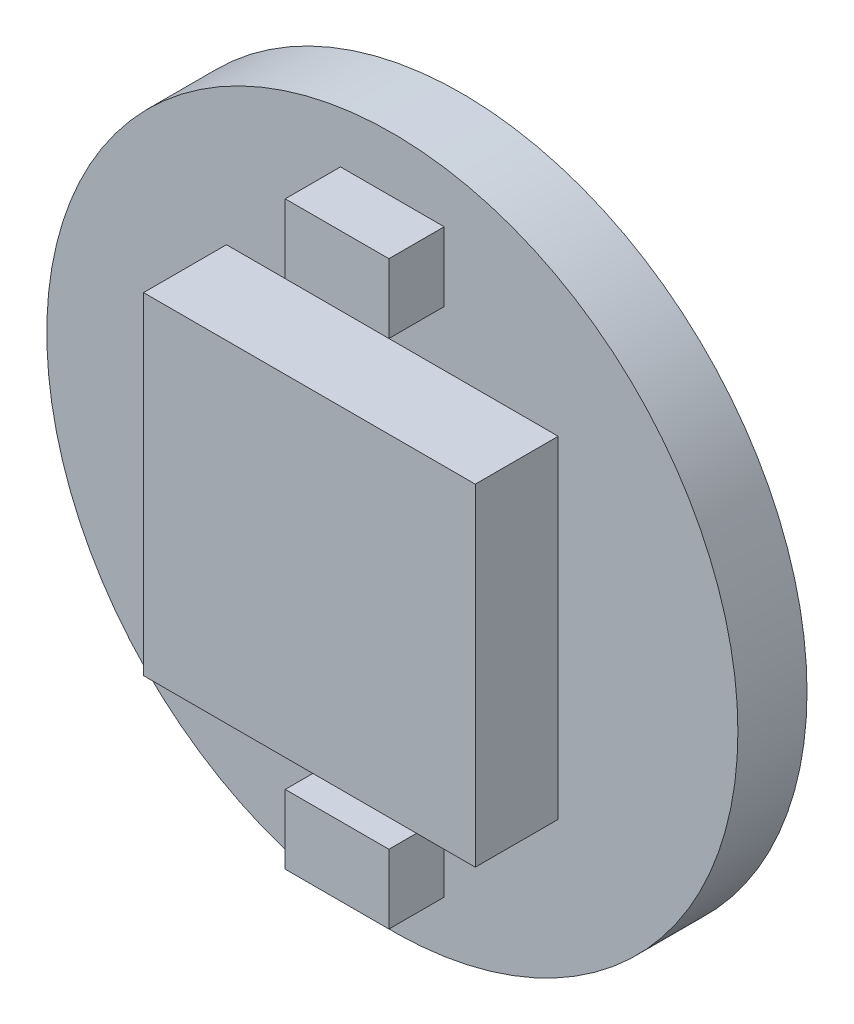
ISO-10303-21;
HEADER;
FILE_DESCRIPTION(('STEP AP214'),'2;1');
FILE_NAME('part.step','',(''),(''),'','','');
FILE_SCHEMA(('AUTOMOTIVE_DESIGN { 1 0 10303 214 1 1 1 1 }'));
ENDSEC;
DATA;
#1=APPLICATION_CONTEXT('core data for automotive mechanical design processes');
#2=APPLICATION_PROTOCOL_DEFINITION('international standard','automotive_design',2000,#1);
#3=PRODUCT_CONTEXT('',#1,'mechanical');
#4=PRODUCT('Part','Part','',(#3));
#5=PRODUCT_RELATED_PRODUCT_CATEGORY('part','',(#4));
#6=PRODUCT_DEFINITION_FORMATION('','',#4);
#7=PRODUCT_DEFINITION_CONTEXT('part definition',#1,'design');
#8=PRODUCT_DEFINITION('design','',#6,#7);
#9=PRODUCT_DEFINITION_SHAPE('','',#8);
#10=(LENGTH_UNIT() NAMED_UNIT(*) SI_UNIT(.MILLI.,.METRE.));
#11=(NAMED_UNIT(*) PLANE_ANGLE_UNIT() SI_UNIT($,.RADIAN.));
#12=(NAMED_UNIT(*) SI_UNIT($,.STERADIAN.) SOLID_ANGLE_UNIT());
#13=UNCERTAINTY_MEASURE_WITH_UNIT(LENGTH_MEASURE(1.E-05),#10,'distance_accuracy_value','');
#14=(GEOMETRIC_REPRESENTATION_CONTEXT(3) GLOBAL_UNCERTAINTY_ASSIGNED_CONTEXT((#13)) GLOBAL_UNIT_ASSIGNED_CONTEXT((#10,
#11,#12)) REPRESENTATION_CONTEXT('',''));
#15=CARTESIAN_POINT('',(0.,0.,0.));
#16=DIRECTION('',(0.,0.,1.));
#17=DIRECTION('',(1.,0.,0.));
#18=AXIS2_PLACEMENT_3D('',#15,#16,#17);
#19=CARTESIAN_POINT('',(0.,0.,1.));
#20=DIRECTION('',(0.,0.,-1.));
#21=DIRECTION('',(-1.,0.,0.));
#22=AXIS2_PLACEMENT_3D('',#19,#20,#21);
#23=CYLINDRICAL_SURFACE('',#22,5.);
#24=CARTESIAN_POINT('',(0.,0.,1.));
#25=DIRECTION('',(0.,0.,1.));
#26=DIRECTION('',(1.,0.,0.));
#27=AXIS2_PLACEMENT_3D('',#24,#25,#26);
#28=CIRCLE('',#27,5.);
#29=CARTESIAN_POINT('',(5.,0.,1.));
#30=VERTEX_POINT('',#29);
#31=EDGE_CURVE('E11',#30,#30,#28,.T.);
#32=ORIENTED_EDGE('',*,*,#31,.F.);
#33=EDGE_LOOP('',(#32));
#34=FACE_BOUND('',#33,.T.);
#35=CARTESIAN_POINT('',(0.,0.,0.));
#36=DIRECTION('',(0.,0.,1.));
#37=DIRECTION('',(1.,0.,0.));
#38=AXIS2_PLACEMENT_3D('',#35,#36,#37);
#39=CIRCLE('',#38,5.);
#40=CARTESIAN_POINT('',(5.,0.,0.));
#41=VERTEX_POINT('',#40);
#42=EDGE_CURVE('E54',#41,#41,#39,.T.);
#43=ORIENTED_EDGE('',*,*,#42,.T.);
#44=EDGE_LOOP('',(#43));
#45=FACE_BOUND('',#44,.T.);
#46=ADVANCED_FACE('F51',(#34,#45),#23,.T.);
#47=CARTESIAN_POINT('',(0.,0.,1.));
#48=DIRECTION('',(0.,0.,1.));
#49=DIRECTION('',(1.,0.,0.));
#50=AXIS2_PLACEMENT_3D('',#47,#48,#49);
#51=PLANE('',#50);
#52=DIRECTION('',(0.,-1.,0.));
#53=VECTOR('',#52,1.);
#54=CARTESIAN_POINT('',(0.75,0.,1.));
#55=LINE('',#54,#53);
#56=CARTESIAN_POINT('',(0.75,4.2,1.));
#57=VERTEX_POINT('',#56);
#58=CARTESIAN_POINT('',(0.75,3.2,1.));
#59=VERTEX_POINT('',#58);
#60=EDGE_CURVE('E147',#57,#59,#55,.T.);
#61=ORIENTED_EDGE('',*,*,#60,.T.);
#62=DIRECTION('',(1.,0.,0.));
#63=VECTOR('',#62,1.);
#64=CARTESIAN_POINT('',(0.,3.2,1.));
#65=LINE('',#64,#63);
#66=CARTESIAN_POINT('',(-0.75,3.2,1.));
#67=VERTEX_POINT('',#66);
#68=EDGE_CURVE('E163',#67,#59,#65,.T.);
#69=ORIENTED_EDGE('',*,*,#68,.F.);
#70=DIRECTION('',(0.,-1.,0.));
#71=VECTOR('',#70,1.);
#72=CARTESIAN_POINT('',(-0.749999999999999,0.,1.));
#73=LINE('',#72,#71);
#74=CARTESIAN_POINT('',(-0.75,4.2,1.));
#75=VERTEX_POINT('',#74);
#76=EDGE_CURVE('E181',#75,#67,#73,.T.);
#77=ORIENTED_EDGE('',*,*,#76,.F.);
#78=DIRECTION('',(1.,0.,0.));
#79=VECTOR('',#78,1.);
#80=CARTESIAN_POINT('',(0.,4.2,1.));
#81=LINE('',#80,#79);
#82=EDGE_CURVE('E178',#75,#57,#81,.T.);
#83=ORIENTED_EDGE('',*,*,#82,.T.);
#84=EDGE_LOOP('',(#61,#69,#77,#83));
#85=FACE_BOUND('',#84,.T.);
#86=DIRECTION('',(0.,1.,0.));
#87=VECTOR('',#86,1.);
#88=CARTESIAN_POINT('',(-0.749999999999999,0.,1.));
#89=LINE('',#88,#87);
#90=CARTESIAN_POINT('',(-0.75,-4.2,1.));
#91=VERTEX_POINT('',#90);
#92=CARTESIAN_POINT('',(-0.75,-3.2,1.));
#93=VERTEX_POINT('',#92);
#94=EDGE_CURVE('E153',#91,#93,#89,.T.);
#95=ORIENTED_EDGE('',*,*,#94,.T.);
#96=DIRECTION('',(1.,0.,0.));
#97=VECTOR('',#96,1.);
#98=CARTESIAN_POINT('',(0.,-3.2,1.));
#99=LINE('',#98,#97);
#100=CARTESIAN_POINT('',(0.75,-3.2,1.));
#101=VERTEX_POINT('',#100);
#102=EDGE_CURVE('E197',#93,#101,#99,.T.);
#103=ORIENTED_EDGE('',*,*,#102,.T.);
#104=DIRECTION('',(0.,1.,0.));
#105=VECTOR('',#104,1.);
#106=CARTESIAN_POINT('',(0.75,0.,1.));
#107=LINE('',#106,#105);
#108=CARTESIAN_POINT('',(0.75,-4.2,1.));
#109=VERTEX_POINT('',#108);
#110=EDGE_CURVE('E212',#109,#101,#107,.T.);
#111=ORIENTED_EDGE('',*,*,#110,.F.);
#112=DIRECTION('',(1.,0.,0.));
#113=VECTOR('',#112,1.);
#114=CARTESIAN_POINT('',(0.,-4.2,1.));
#115=LINE('',#114,#113);
#116=EDGE_CURVE('E74',#91,#109,#115,.T.);
#117=ORIENTED_EDGE('',*,*,#116,.F.);
#118=EDGE_LOOP('',(#95,#103,#111,#117));
#119=FACE_BOUND('',#118,.T.);
#120=DIRECTION('',(0.,1.,0.));
#121=VECTOR('',#120,1.);
#122=CARTESIAN_POINT('',(2.4,2.4,1.));
#123=LINE('',#122,#121);
#124=CARTESIAN_POINT('',(2.4,-2.4,1.));
#125=VERTEX_POINT('',#124);
#126=CARTESIAN_POINT('',(2.4,2.4,1.));
#127=VERTEX_POINT('',#126);
#128=EDGE_CURVE('E232',#125,#127,#123,.T.);
#129=ORIENTED_EDGE('',*,*,#128,.F.);
#130=DIRECTION('',(1.,0.,0.));
#131=VECTOR('',#130,1.);
#132=CARTESIAN_POINT('',(-2.4,-2.4,1.));
#133=LINE('',#132,#131);
#134=CARTESIAN_POINT('',(-2.4,-2.4,1.));
#135=VERTEX_POINT('',#134);
#136=EDGE_CURVE('E238',#135,#125,#133,.T.);
#137=ORIENTED_EDGE('',*,*,#136,.F.);
#138=DIRECTION('',(0.,-1.,0.));
#139=VECTOR('',#138,1.);
#140=CARTESIAN_POINT('',(-2.4,2.4,1.));
#141=LINE('',#140,#139);
#142=CARTESIAN_POINT('',(-2.4,2.4,1.));
#143=VERTEX_POINT('',#142);
#144=EDGE_CURVE('E255',#143,#135,#141,.T.);
#145=ORIENTED_EDGE('',*,*,#144,.F.);
#146=DIRECTION('',(-1.,0.,0.));
#147=VECTOR('',#146,1.);
#148=CARTESIAN_POINT('',(-2.4,2.4,1.));
#149=LINE('',#148,#147);
#150=EDGE_CURVE('E251',#127,#143,#149,.T.);
#151=ORIENTED_EDGE('',*,*,#150,.F.);
#152=EDGE_LOOP('',(#129,#137,#145,#151));
#153=FACE_BOUND('',#152,.T.);
#154=ORIENTED_EDGE('',*,*,#31,.T.);
#155=EDGE_LOOP('',(#154));
#156=FACE_BOUND('',#155,.T.);
#157=ADVANCED_FACE('F286',(#85,#119,#153,#156),#51,.T.);
#158=CARTESIAN_POINT('',(0.,0.,0.));
#159=DIRECTION('',(0.,0.,1.));
#160=DIRECTION('',(1.,0.,0.));
#161=AXIS2_PLACEMENT_3D('',#158,#159,#160);
#162=PLANE('',#161);
#163=ORIENTED_EDGE('',*,*,#42,.F.);
#164=EDGE_LOOP('',(#163));
#165=FACE_BOUND('',#164,.T.);
#166=ADVANCED_FACE('F283',(#165),#162,.F.);
#167=CARTESIAN_POINT('',(2.4,2.4,2.2));
#168=DIRECTION('',(-1.,0.,0.));
#169=DIRECTION('',(0.,-1.,0.));
#170=AXIS2_PLACEMENT_3D('',#167,#168,#169);
#171=PLANE('',#170);
#172=ORIENTED_EDGE('',*,*,#128,.T.);
#173=DIRECTION('',(0.,0.,-1.));
#174=VECTOR('',#173,1.);
#175=CARTESIAN_POINT('',(2.4,2.4,2.2));
#176=LINE('',#175,#174);
#177=CARTESIAN_POINT('',(2.4,2.4,2.2));
#178=VERTEX_POINT('',#177);
#179=EDGE_CURVE('E273',#178,#127,#176,.T.);
#180=ORIENTED_EDGE('',*,*,#179,.F.);
#181=DIRECTION('',(0.,1.,0.));
#182=VECTOR('',#181,1.);
#183=CARTESIAN_POINT('',(2.4,2.4,2.2));
#184=LINE('',#183,#182);
#185=CARTESIAN_POINT('',(2.4,-2.4,2.2));
#186=VERTEX_POINT('',#185);
#187=EDGE_CURVE('E233',#186,#178,#184,.T.);
#188=ORIENTED_EDGE('',*,*,#187,.F.);
#189=DIRECTION('',(0.,0.,-1.));
#190=VECTOR('',#189,1.);
#191=CARTESIAN_POINT('',(2.4,-2.4,2.2));
#192=LINE('',#191,#190);
#193=EDGE_CURVE('E247',#186,#125,#192,.T.);
#194=ORIENTED_EDGE('',*,*,#193,.T.);
#195=EDGE_LOOP('',(#172,#180,#188,#194));
#196=FACE_BOUND('',#195,.T.);
#197=ADVANCED_FACE('F285',(#196),#171,.F.);
#198=CARTESIAN_POINT('',(-2.4,2.4,2.2));
#199=DIRECTION('',(0.,-1.,0.));
#200=DIRECTION('',(0.,0.,-1.));
#201=AXIS2_PLACEMENT_3D('',#198,#199,#200);
#202=PLANE('',#201);
#203=ORIENTED_EDGE('',*,*,#150,.T.);
#204=DIRECTION('',(0.,0.,-1.));
#205=VECTOR('',#204,1.);
#206=CARTESIAN_POINT('',(-2.4,2.4,2.2));
#207=LINE('',#206,#205);
#208=CARTESIAN_POINT('',(-2.4,2.4,2.2));
#209=VERTEX_POINT('',#208);
#210=EDGE_CURVE('E269',#209,#143,#207,.T.);
#211=ORIENTED_EDGE('',*,*,#210,.F.);
#212=DIRECTION('',(-1.,0.,0.));
#213=VECTOR('',#212,1.);
#214=CARTESIAN_POINT('',(-2.4,2.4,2.2));
#215=LINE('',#214,#213);
#216=EDGE_CURVE('E237',#178,#209,#215,.T.);
#217=ORIENTED_EDGE('',*,*,#216,.F.);
#218=ORIENTED_EDGE('',*,*,#179,.T.);
#219=EDGE_LOOP('',(#203,#211,#217,#218));
#220=FACE_BOUND('',#219,.T.);
#221=ADVANCED_FACE('F291',(#220),#202,.F.);
#222=CARTESIAN_POINT('',(-2.4,2.4,2.2));
#223=DIRECTION('',(1.,0.,0.));
#224=DIRECTION('',(0.,1.,0.));
#225=AXIS2_PLACEMENT_3D('',#222,#223,#224);
#226=PLANE('',#225);
#227=ORIENTED_EDGE('',*,*,#144,.T.);
#228=DIRECTION('',(0.,0.,-1.));
#229=VECTOR('',#228,1.);
#230=CARTESIAN_POINT('',(-2.4,-2.4,2.2));
#231=LINE('',#230,#229);
#232=CARTESIAN_POINT('',(-2.4,-2.4,2.2));
#233=VERTEX_POINT('',#232);
#234=EDGE_CURVE('E265',#233,#135,#231,.T.);
#235=ORIENTED_EDGE('',*,*,#234,.F.);
#236=DIRECTION('',(0.,-1.,0.));
#237=VECTOR('',#236,1.);
#238=CARTESIAN_POINT('',(-2.4,2.4,2.2));
#239=LINE('',#238,#237);
#240=EDGE_CURVE('E241',#209,#233,#239,.T.);
#241=ORIENTED_EDGE('',*,*,#240,.F.);
#242=ORIENTED_EDGE('',*,*,#210,.T.);
#243=EDGE_LOOP('',(#227,#235,#241,#242));
#244=FACE_BOUND('',#243,.T.);
#245=ADVANCED_FACE('F327',(#244),#226,.F.);
#246=CARTESIAN_POINT('',(-2.4,-2.4,2.2));
#247=DIRECTION('',(0.,1.,0.));
#248=DIRECTION('',(0.,0.,1.));
#249=AXIS2_PLACEMENT_3D('',#246,#247,#248);
#250=PLANE('',#249);
#251=ORIENTED_EDGE('',*,*,#136,.T.);
#252=ORIENTED_EDGE('',*,*,#193,.F.);
#253=DIRECTION('',(1.,0.,0.));
#254=VECTOR('',#253,1.);
#255=CARTESIAN_POINT('',(-2.4,-2.4,2.2));
#256=LINE('',#255,#254);
#257=EDGE_CURVE('E244',#233,#186,#256,.T.);
#258=ORIENTED_EDGE('',*,*,#257,.F.);
#259=ORIENTED_EDGE('',*,*,#234,.T.);
#260=EDGE_LOOP('',(#251,#252,#258,#259));
#261=FACE_BOUND('',#260,.T.);
#262=ADVANCED_FACE('F336',(#261),#250,.F.);
#263=CARTESIAN_POINT('',(0.,0.,2.2));
#264=DIRECTION('',(0.,0.,1.));
#265=DIRECTION('',(1.,0.,0.));
#266=AXIS2_PLACEMENT_3D('',#263,#264,#265);
#267=PLANE('',#266);
#268=ORIENTED_EDGE('',*,*,#187,.T.);
#269=ORIENTED_EDGE('',*,*,#216,.T.);
#270=ORIENTED_EDGE('',*,*,#240,.T.);
#271=ORIENTED_EDGE('',*,*,#257,.T.);
#272=EDGE_LOOP('',(#268,#269,#270,#271));
#273=FACE_BOUND('',#272,.T.);
#274=ADVANCED_FACE('F346',(#273),#267,.T.);
#275=CARTESIAN_POINT('',(-0.749999999999999,0.,1.8));
#276=DIRECTION('',(-1.,0.,0.));
#277=DIRECTION('',(0.,-1.,0.));
#278=AXIS2_PLACEMENT_3D('',#275,#276,#277);
#279=PLANE('',#278);
#280=ORIENTED_EDGE('',*,*,#94,.F.);
#281=DIRECTION('',(0.,0.,-1.));
#282=VECTOR('',#281,1.);
#283=CARTESIAN_POINT('',(-0.75,-4.2,1.8));
#284=LINE('',#283,#282);
#285=CARTESIAN_POINT('',(-0.75,-4.2,1.8));
#286=VERTEX_POINT('',#285);
#287=EDGE_CURVE('E229',#286,#91,#284,.T.);
#288=ORIENTED_EDGE('',*,*,#287,.F.);
#289=DIRECTION('',(0.,1.,0.));
#290=VECTOR('',#289,1.);
#291=CARTESIAN_POINT('',(-0.749999999999999,0.,1.8));
#292=LINE('',#291,#290);
#293=CARTESIAN_POINT('',(-0.75,-3.2,1.8));
#294=VERTEX_POINT('',#293);
#295=EDGE_CURVE('E192',#286,#294,#292,.T.);
#296=ORIENTED_EDGE('',*,*,#295,.T.);
#297=DIRECTION('',(0.,0.,-1.));
#298=VECTOR('',#297,1.);
#299=CARTESIAN_POINT('',(-0.75,-3.2,1.8));
#300=LINE('',#299,#298);
#301=EDGE_CURVE('E207',#294,#93,#300,.T.);
#302=ORIENTED_EDGE('',*,*,#301,.T.);
#303=EDGE_LOOP('',(#280,#288,#296,#302));
#304=FACE_BOUND('',#303,.T.);
#305=ADVANCED_FACE('F355',(#304),#279,.T.);
#306=CARTESIAN_POINT('',(0.,-4.2,1.8));
#307=DIRECTION('',(0.,1.,0.));
#308=DIRECTION('',(0.,0.,1.));
#309=AXIS2_PLACEMENT_3D('',#306,#307,#308);
#310=PLANE('',#309);
#311=ORIENTED_EDGE('',*,*,#116,.T.);
#312=DIRECTION('',(0.,0.,-1.));
#313=VECTOR('',#312,1.);
#314=CARTESIAN_POINT('',(0.75,-4.2,1.8));
#315=LINE('',#314,#313);
#316=CARTESIAN_POINT('',(0.75,-4.2,1.8));
#317=VERTEX_POINT('',#316);
#318=EDGE_CURVE('E225',#317,#109,#315,.T.);
#319=ORIENTED_EDGE('',*,*,#318,.F.);
#320=DIRECTION('',(1.,0.,0.));
#321=VECTOR('',#320,1.);
#322=CARTESIAN_POINT('',(0.,-4.2,1.8));
#323=LINE('',#322,#321);
#324=EDGE_CURVE('E196',#286,#317,#323,.T.);
#325=ORIENTED_EDGE('',*,*,#324,.F.);
#326=ORIENTED_EDGE('',*,*,#287,.T.);
#327=EDGE_LOOP('',(#311,#319,#325,#326));
#328=FACE_BOUND('',#327,.T.);
#329=ADVANCED_FACE('F364',(#328),#310,.F.);
#330=CARTESIAN_POINT('',(0.75,0.,1.8));
#331=DIRECTION('',(-1.,0.,0.));
#332=DIRECTION('',(0.,0.,1.));
#333=AXIS2_PLACEMENT_3D('',#330,#331,#332);
#334=PLANE('',#333);
#335=ORIENTED_EDGE('',*,*,#110,.T.);
#336=DIRECTION('',(0.,0.,-1.));
#337=VECTOR('',#336,1.);
#338=CARTESIAN_POINT('',(0.75,-3.2,1.8));
#339=LINE('',#338,#337);
#340=CARTESIAN_POINT('',(0.75,-3.2,1.8));
#341=VERTEX_POINT('',#340);
#342=EDGE_CURVE('E221',#341,#101,#339,.T.);
#343=ORIENTED_EDGE('',*,*,#342,.F.);
#344=DIRECTION('',(0.,1.,0.));
#345=VECTOR('',#344,1.);
#346=CARTESIAN_POINT('',(0.75,0.,1.8));
#347=LINE('',#346,#345);
#348=EDGE_CURVE('E200',#317,#341,#347,.T.);
#349=ORIENTED_EDGE('',*,*,#348,.F.);
#350=ORIENTED_EDGE('',*,*,#318,.T.);
#351=EDGE_LOOP('',(#335,#343,#349,#350));
#352=FACE_BOUND('',#351,.T.);
#353=ADVANCED_FACE('F374',(#352),#334,.F.);
#354=CARTESIAN_POINT('',(0.,-3.2,1.8));
#355=DIRECTION('',(0.,1.,0.));
#356=DIRECTION('',(0.,0.,1.));
#357=AXIS2_PLACEMENT_3D('',#354,#355,#356);
#358=PLANE('',#357);
#359=ORIENTED_EDGE('',*,*,#102,.F.);
#360=ORIENTED_EDGE('',*,*,#301,.F.);
#361=DIRECTION('',(1.,0.,0.));
#362=VECTOR('',#361,1.);
#363=CARTESIAN_POINT('',(0.,-3.2,1.8));
#364=LINE('',#363,#362);
#365=EDGE_CURVE('E203',#294,#341,#364,.T.);
#366=ORIENTED_EDGE('',*,*,#365,.T.);
#367=ORIENTED_EDGE('',*,*,#342,.T.);
#368=EDGE_LOOP('',(#359,#360,#366,#367));
#369=FACE_BOUND('',#368,.T.);
#370=ADVANCED_FACE('F384',(#369),#358,.T.);
#371=CARTESIAN_POINT('',(0.,0.,1.8));
#372=DIRECTION('',(0.,0.,1.));
#373=DIRECTION('',(1.,0.,0.));
#374=AXIS2_PLACEMENT_3D('',#371,#372,#373);
#375=PLANE('',#374);
#376=ORIENTED_EDGE('',*,*,#295,.F.);
#377=ORIENTED_EDGE('',*,*,#324,.T.);
#378=ORIENTED_EDGE('',*,*,#348,.T.);
#379=ORIENTED_EDGE('',*,*,#365,.F.);
#380=EDGE_LOOP('',(#376,#377,#378,#379));
#381=FACE_BOUND('',#380,.T.);
#382=ADVANCED_FACE('F394',(#381),#375,.T.);
#383=CARTESIAN_POINT('',(0.75,0.,1.8));
#384=DIRECTION('',(1.,0.,0.));
#385=DIRECTION('',(0.,0.,-1.));
#386=AXIS2_PLACEMENT_3D('',#383,#384,#385);
#387=PLANE('',#386);
#388=ORIENTED_EDGE('',*,*,#60,.F.);
#389=DIRECTION('',(0.,0.,-1.));
#390=VECTOR('',#389,1.);
#391=CARTESIAN_POINT('',(0.75,4.2,1.8));
#392=LINE('',#391,#390);
#393=CARTESIAN_POINT('',(0.75,4.2,1.8));
#394=VERTEX_POINT('',#393);
#395=EDGE_CURVE('E142',#394,#57,#392,.T.);
#396=ORIENTED_EDGE('',*,*,#395,.F.);
#397=DIRECTION('',(0.,-1.,0.));
#398=VECTOR('',#397,1.);
#399=CARTESIAN_POINT('',(0.75,0.,1.8));
#400=LINE('',#399,#398);
#401=CARTESIAN_POINT('',(0.75,3.2,1.8));
#402=VERTEX_POINT('',#401);
#403=EDGE_CURVE('E145',#394,#402,#400,.T.);
#404=ORIENTED_EDGE('',*,*,#403,.T.);
#405=DIRECTION('',(0.,0.,-1.));
#406=VECTOR('',#405,1.);
#407=CARTESIAN_POINT('',(0.75,3.2,1.8));
#408=LINE('',#407,#406);
#409=EDGE_CURVE('E175',#402,#59,#408,.T.);
#410=ORIENTED_EDGE('',*,*,#409,.T.);
#411=EDGE_LOOP('',(#388,#396,#404,#410));
#412=FACE_BOUND('',#411,.T.);
#413=ADVANCED_FACE('F144',(#412),#387,.T.);
#414=CARTESIAN_POINT('',(0.,4.2,1.8));
#415=DIRECTION('',(0.,1.,0.));
#416=DIRECTION('',(0.,0.,1.));
#417=AXIS2_PLACEMENT_3D('',#414,#415,#416);
#418=PLANE('',#417);
#419=ORIENTED_EDGE('',*,*,#82,.F.);
#420=DIRECTION('',(0.,0.,-1.));
#421=VECTOR('',#420,1.);
#422=CARTESIAN_POINT('',(-0.75,4.2,1.8));
#423=LINE('',#422,#421);
#424=CARTESIAN_POINT('',(-0.75,4.2,1.8));
#425=VERTEX_POINT('',#424);
#426=EDGE_CURVE('E154',#425,#75,#423,.T.);
#427=ORIENTED_EDGE('',*,*,#426,.F.);
#428=DIRECTION('',(1.,0.,0.));
#429=VECTOR('',#428,1.);
#430=CARTESIAN_POINT('',(0.,4.2,1.8));
#431=LINE('',#430,#429);
#432=EDGE_CURVE('E159',#425,#394,#431,.T.);
#433=ORIENTED_EDGE('',*,*,#432,.T.);
#434=ORIENTED_EDGE('',*,*,#395,.T.);
#435=EDGE_LOOP('',(#419,#427,#433,#434));
#436=FACE_BOUND('',#435,.T.);
#437=ADVANCED_FACE('F165',(#436),#418,.T.);
#438=CARTESIAN_POINT('',(-0.749999999999999,0.,1.8));
#439=DIRECTION('',(1.,0.,0.));
#440=DIRECTION('',(0.,1.,0.));
#441=AXIS2_PLACEMENT_3D('',#438,#439,#440);
#442=PLANE('',#441);
#443=ORIENTED_EDGE('',*,*,#76,.T.);
#444=DIRECTION('',(0.,0.,-1.));
#445=VECTOR('',#444,1.);
#446=CARTESIAN_POINT('',(-0.75,3.2,1.8));
#447=LINE('',#446,#445);
#448=CARTESIAN_POINT('',(-0.75,3.2,1.8));
#449=VERTEX_POINT('',#448);
#450=EDGE_CURVE('E66',#449,#67,#447,.T.);
#451=ORIENTED_EDGE('',*,*,#450,.F.);
#452=DIRECTION('',(0.,-1.,0.));
#453=VECTOR('',#452,1.);
#454=CARTESIAN_POINT('',(-0.749999999999999,0.,1.8));
#455=LINE('',#454,#453);
#456=EDGE_CURVE('E168',#425,#449,#455,.T.);
#457=ORIENTED_EDGE('',*,*,#456,.F.);
#458=ORIENTED_EDGE('',*,*,#426,.T.);
#459=EDGE_LOOP('',(#443,#451,#457,#458));
#460=FACE_BOUND('',#459,.T.);
#461=ADVANCED_FACE('F421',(#460),#442,.F.);
#462=CARTESIAN_POINT('',(0.,3.2,1.8));
#463=DIRECTION('',(0.,1.,0.));
#464=DIRECTION('',(0.,0.,1.));
#465=AXIS2_PLACEMENT_3D('',#462,#463,#464);
#466=PLANE('',#465);
#467=ORIENTED_EDGE('',*,*,#68,.T.);
#468=ORIENTED_EDGE('',*,*,#409,.F.);
#469=DIRECTION('',(1.,0.,0.));
#470=VECTOR('',#469,1.);
#471=CARTESIAN_POINT('',(0.,3.2,1.8));
#472=LINE('',#471,#470);
#473=EDGE_CURVE('E160',#449,#402,#472,.T.);
#474=ORIENTED_EDGE('',*,*,#473,.F.);
#475=ORIENTED_EDGE('',*,*,#450,.T.);
#476=EDGE_LOOP('',(#467,#468,#474,#475));
#477=FACE_BOUND('',#476,.T.);
#478=ADVANCED_FACE('F430',(#477),#466,.F.);
#479=CARTESIAN_POINT('',(0.,0.,1.8));
#480=DIRECTION('',(0.,0.,1.));
#481=DIRECTION('',(1.,0.,0.));
#482=AXIS2_PLACEMENT_3D('',#479,#480,#481);
#483=PLANE('',#482);
#484=ORIENTED_EDGE('',*,*,#403,.F.);
#485=ORIENTED_EDGE('',*,*,#432,.F.);
#486=ORIENTED_EDGE('',*,*,#456,.T.);
#487=ORIENTED_EDGE('',*,*,#473,.T.);
#488=EDGE_LOOP('',(#484,#485,#486,#487));
#489=FACE_BOUND('',#488,.T.);
#490=ADVANCED_FACE('F158',(#489),#483,.T.);
#491=CLOSED_SHELL('',(#46,#157,#166,#197,#221,#245,#262,#274,#305,#329,#353,#370,#382,#413,#437,
#461,#478,#490));
#492=MANIFOLD_SOLID_BREP('B2',#491);
#493=ADVANCED_BREP_SHAPE_REPRESENTATION('',(#18,#492),#14);
#494=SHAPE_DEFINITION_REPRESENTATION(#9,#493);
ENDSEC;
END-ISO-10303-21;
